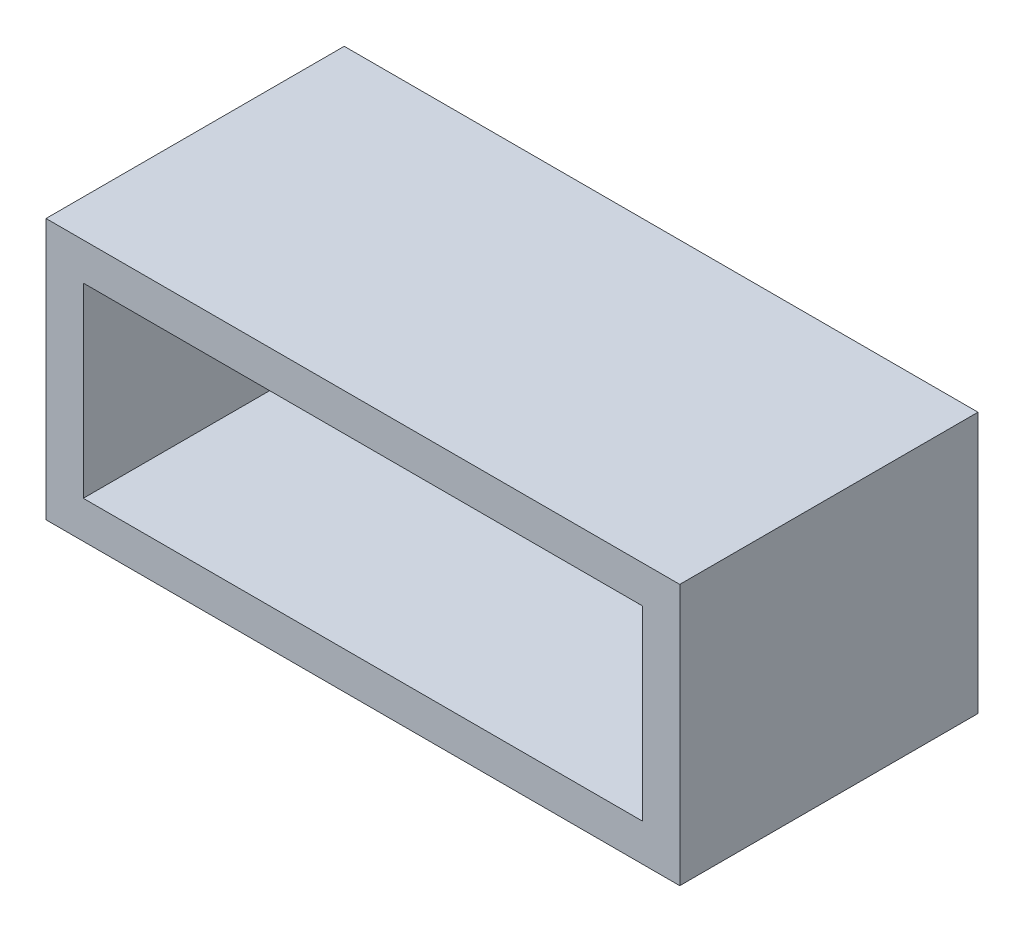
ISO-10303-21;
HEADER;
FILE_DESCRIPTION(('STEP AP214'),'2;1');
FILE_NAME('part.step','',(''),(''),'','','');
FILE_SCHEMA(('AUTOMOTIVE_DESIGN { 1 0 10303 214 1 1 1 1 }'));
ENDSEC;
DATA;
#1=APPLICATION_CONTEXT('core data for automotive mechanical design processes');
#2=APPLICATION_PROTOCOL_DEFINITION('international standard','automotive_design',2000,#1);
#3=PRODUCT_CONTEXT('',#1,'mechanical');
#4=PRODUCT('Part','Part','',(#3));
#5=PRODUCT_RELATED_PRODUCT_CATEGORY('part','',(#4));
#6=PRODUCT_DEFINITION_FORMATION('','',#4);
#7=PRODUCT_DEFINITION_CONTEXT('part definition',#1,'design');
#8=PRODUCT_DEFINITION('design','',#6,#7);
#9=PRODUCT_DEFINITION_SHAPE('','',#8);
#10=(LENGTH_UNIT() NAMED_UNIT(*) SI_UNIT(.MILLI.,.METRE.));
#11=(NAMED_UNIT(*) PLANE_ANGLE_UNIT() SI_UNIT($,.RADIAN.));
#12=(NAMED_UNIT(*) SI_UNIT($,.STERADIAN.) SOLID_ANGLE_UNIT());
#13=UNCERTAINTY_MEASURE_WITH_UNIT(LENGTH_MEASURE(1.E-05),#10,'distance_accuracy_value','');
#14=(GEOMETRIC_REPRESENTATION_CONTEXT(3) GLOBAL_UNCERTAINTY_ASSIGNED_CONTEXT((#13)) GLOBAL_UNIT_ASSIGNED_CONTEXT((#10,
#11,#12)) REPRESENTATION_CONTEXT('',''));
#15=CARTESIAN_POINT('',(0.,0.,0.));
#16=DIRECTION('',(0.,0.,1.));
#17=DIRECTION('',(1.,0.,0.));
#18=AXIS2_PLACEMENT_3D('',#15,#16,#17);
#19=CARTESIAN_POINT('',(75.,-25.,80.));
#20=DIRECTION('',(-1.,0.,0.));
#21=DIRECTION('',(0.,-1.,0.));
#22=AXIS2_PLACEMENT_3D('',#19,#20,#21);
#23=PLANE('',#22);
#24=DIRECTION('',(0.,1.,0.));
#25=VECTOR('',#24,1.);
#26=CARTESIAN_POINT('',(75.,25.,10.));
#27=LINE('',#26,#25);
#28=CARTESIAN_POINT('',(75.,12.,9.99999999999999));
#29=VERTEX_POINT('',#28);
#30=CARTESIAN_POINT('',(75.,25.,9.99999999999999));
#31=VERTEX_POINT('',#30);
#32=EDGE_CURVE('E181',#29,#31,#27,.T.);
#33=ORIENTED_EDGE('',*,*,#32,.F.);
#34=DIRECTION('',(0.,0.,1.));
#35=VECTOR('',#34,1.);
#36=CARTESIAN_POINT('',(75.,12.,0.));
#37=LINE('',#36,#35);
#38=CARTESIAN_POINT('',(75.,12.,0.));
#39=VERTEX_POINT('',#38);
#40=EDGE_CURVE('E190',#39,#29,#37,.T.);
#41=ORIENTED_EDGE('',*,*,#40,.F.);
#42=DIRECTION('',(0.,1.,0.));
#43=VECTOR('',#42,1.);
#44=CARTESIAN_POINT('',(75.,-25.,0.));
#45=LINE('',#44,#43);
#46=CARTESIAN_POINT('',(75.,-25.,0.));
#47=VERTEX_POINT('',#46);
#48=EDGE_CURVE('E218',#47,#39,#45,.T.);
#49=ORIENTED_EDGE('',*,*,#48,.F.);
#50=DIRECTION('',(0.,0.,-1.));
#51=VECTOR('',#50,1.);
#52=CARTESIAN_POINT('',(75.,-25.,80.));
#53=LINE('',#52,#51);
#54=CARTESIAN_POINT('',(75.,-25.,80.));
#55=VERTEX_POINT('',#54);
#56=EDGE_CURVE('E226',#55,#47,#53,.T.);
#57=ORIENTED_EDGE('',*,*,#56,.F.);
#58=DIRECTION('',(0.,1.,0.));
#59=VECTOR('',#58,1.);
#60=CARTESIAN_POINT('',(75.,-25.,80.));
#61=LINE('',#60,#59);
#62=CARTESIAN_POINT('',(75.,25.,80.));
#63=VERTEX_POINT('',#62);
#64=EDGE_CURVE('E208',#55,#63,#61,.T.);
#65=ORIENTED_EDGE('',*,*,#64,.T.);
#66=DIRECTION('',(0.,0.,-1.));
#67=VECTOR('',#66,1.);
#68=CARTESIAN_POINT('',(75.,25.,80.));
#69=LINE('',#68,#67);
#70=EDGE_CURVE('E223',#63,#31,#69,.T.);
#71=ORIENTED_EDGE('',*,*,#70,.T.);
#72=EDGE_LOOP('',(#33,#41,#49,#57,#65,#71));
#73=FACE_BOUND('',#72,.T.);
#74=ADVANCED_FACE('F42',(#73),#23,.T.);
#75=CARTESIAN_POINT('',(-75.0000000000001,25.,80.));
#76=DIRECTION('',(0.,-1.,0.));
#77=DIRECTION('',(1.,0.,0.));
#78=AXIS2_PLACEMENT_3D('',#75,#76,#77);
#79=PLANE('',#78);
#80=DIRECTION('',(-1.,0.,0.));
#81=VECTOR('',#80,1.);
#82=CARTESIAN_POINT('',(-60.,25.,10.));
#83=LINE('',#82,#81);
#84=CARTESIAN_POINT('',(-60.,25.,9.99999999999999));
#85=VERTEX_POINT('',#84);
#86=CARTESIAN_POINT('',(-75.0000000000001,25.,9.99999999999999));
#87=VERTEX_POINT('',#86);
#88=EDGE_CURVE('E59',#85,#87,#83,.T.);
#89=ORIENTED_EDGE('',*,*,#88,.F.);
#90=DIRECTION('',(0.,0.,-1.));
#91=VECTOR('',#90,1.);
#92=CARTESIAN_POINT('',(-60.,25.,0.));
#93=LINE('',#92,#91);
#94=CARTESIAN_POINT('',(-60.,25.,0.));
#95=VERTEX_POINT('',#94);
#96=EDGE_CURVE('E63',#85,#95,#93,.T.);
#97=ORIENTED_EDGE('',*,*,#96,.T.);
#98=DIRECTION('',(-1.,0.,0.));
#99=VECTOR('',#98,1.);
#100=CARTESIAN_POINT('',(-75.0000000000001,25.,0.));
#101=LINE('',#100,#99);
#102=CARTESIAN_POINT('',(60.,25.,0.));
#103=VERTEX_POINT('',#102);
#104=EDGE_CURVE('E206',#103,#95,#101,.T.);
#105=ORIENTED_EDGE('',*,*,#104,.F.);
#106=DIRECTION('',(0.,0.,-1.));
#107=VECTOR('',#106,1.);
#108=CARTESIAN_POINT('',(60.,25.,0.));
#109=LINE('',#108,#107);
#110=CARTESIAN_POINT('',(60.,25.,9.99999999999999));
#111=VERTEX_POINT('',#110);
#112=EDGE_CURVE('E186',#111,#103,#109,.T.);
#113=ORIENTED_EDGE('',*,*,#112,.F.);
#114=DIRECTION('',(1.,0.,0.));
#115=VECTOR('',#114,1.);
#116=CARTESIAN_POINT('',(60.,25.,10.));
#117=LINE('',#116,#115);
#118=EDGE_CURVE('E189',#111,#31,#117,.T.);
#119=ORIENTED_EDGE('',*,*,#118,.T.);
#120=ORIENTED_EDGE('',*,*,#70,.F.);
#121=DIRECTION('',(-1.,0.,0.));
#122=VECTOR('',#121,1.);
#123=CARTESIAN_POINT('',(-75.0000000000001,25.,80.));
#124=LINE('',#123,#122);
#125=CARTESIAN_POINT('',(-75.0000000000001,25.,80.));
#126=VERTEX_POINT('',#125);
#127=EDGE_CURVE('E211',#63,#126,#124,.T.);
#128=ORIENTED_EDGE('',*,*,#127,.T.);
#129=DIRECTION('',(0.,0.,-1.));
#130=VECTOR('',#129,1.);
#131=CARTESIAN_POINT('',(-75.0000000000001,25.,80.));
#132=LINE('',#131,#130);
#133=EDGE_CURVE('E213',#126,#87,#132,.T.);
#134=ORIENTED_EDGE('',*,*,#133,.T.);
#135=EDGE_LOOP('',(#89,#97,#105,#113,#119,#120,#128,#134));
#136=FACE_BOUND('',#135,.T.);
#137=ADVANCED_FACE('F276',(#136),#79,.T.);
#138=CARTESIAN_POINT('',(0.,0.,80.));
#139=DIRECTION('',(0.,0.,-1.));
#140=DIRECTION('',(-1.,0.,0.));
#141=AXIS2_PLACEMENT_3D('',#138,#139,#140);
#142=PLANE('',#141);
#143=DIRECTION('',(0.,1.,0.));
#144=VECTOR('',#143,1.);
#145=CARTESIAN_POINT('',(85.,-35.,80.));
#146=LINE('',#145,#144);
#147=CARTESIAN_POINT('',(85.,-35.,80.));
#148=VERTEX_POINT('',#147);
#149=CARTESIAN_POINT('',(85.,35.,80.));
#150=VERTEX_POINT('',#149);
#151=EDGE_CURVE('E232',#148,#150,#146,.T.);
#152=ORIENTED_EDGE('',*,*,#151,.T.);
#153=DIRECTION('',(-1.,0.,0.));
#154=VECTOR('',#153,1.);
#155=CARTESIAN_POINT('',(-85.,35.,80.));
#156=LINE('',#155,#154);
#157=CARTESIAN_POINT('',(-85.,35.,80.));
#158=VERTEX_POINT('',#157);
#159=EDGE_CURVE('E235',#150,#158,#156,.T.);
#160=ORIENTED_EDGE('',*,*,#159,.T.);
#161=DIRECTION('',(0.,-1.,0.));
#162=VECTOR('',#161,1.);
#163=CARTESIAN_POINT('',(-85.,-35.,80.));
#164=LINE('',#163,#162);
#165=CARTESIAN_POINT('',(-85.,-35.,80.));
#166=VERTEX_POINT('',#165);
#167=EDGE_CURVE('E238',#158,#166,#164,.T.);
#168=ORIENTED_EDGE('',*,*,#167,.T.);
#169=DIRECTION('',(1.,0.,0.));
#170=VECTOR('',#169,1.);
#171=CARTESIAN_POINT('',(-85.,-35.,80.));
#172=LINE('',#171,#170);
#173=EDGE_CURVE('E240',#166,#148,#172,.T.);
#174=ORIENTED_EDGE('',*,*,#173,.T.);
#175=EDGE_LOOP('',(#152,#160,#168,#174));
#176=FACE_BOUND('',#175,.T.);
#177=DIRECTION('',(0.,-1.,0.));
#178=VECTOR('',#177,1.);
#179=CARTESIAN_POINT('',(-75.0000000000001,-25.,80.));
#180=LINE('',#179,#178);
#181=CARTESIAN_POINT('',(-75.0000000000001,-25.,80.));
#182=VERTEX_POINT('',#181);
#183=EDGE_CURVE('E203',#126,#182,#180,.T.);
#184=ORIENTED_EDGE('',*,*,#183,.F.);
#185=ORIENTED_EDGE('',*,*,#127,.F.);
#186=ORIENTED_EDGE('',*,*,#64,.F.);
#187=DIRECTION('',(1.,0.,0.));
#188=VECTOR('',#187,1.);
#189=CARTESIAN_POINT('',(-75.0000000000001,-25.,80.));
#190=LINE('',#189,#188);
#191=EDGE_CURVE('E205',#182,#55,#190,.T.);
#192=ORIENTED_EDGE('',*,*,#191,.F.);
#193=EDGE_LOOP('',(#184,#185,#186,#192));
#194=FACE_BOUND('',#193,.T.);
#195=ADVANCED_FACE('F282',(#176,#194),#142,.F.);
#196=CARTESIAN_POINT('',(0.,0.,0.));
#197=DIRECTION('',(0.,0.,-1.));
#198=DIRECTION('',(-1.,0.,0.));
#199=AXIS2_PLACEMENT_3D('',#196,#197,#198);
#200=PLANE('',#199);
#201=CARTESIAN_POINT('',(-69.4311004696068,20.0599089747284,0.));
#202=DIRECTION('',(0.,0.,1.));
#203=DIRECTION('',(1.,0.,0.));
#204=AXIS2_PLACEMENT_3D('',#201,#202,#203);
#205=CIRCLE('',#204,2.38154170476223);
#206=CARTESIAN_POINT('',(-67.0495587648446,20.0599089747284,0.));
#207=VERTEX_POINT('',#206);
#208=EDGE_CURVE('E346',#207,#207,#205,.T.);
#209=ORIENTED_EDGE('',*,*,#208,.T.);
#210=EDGE_LOOP('',(#209));
#211=FACE_BOUND('',#210,.T.);
#212=CARTESIAN_POINT('',(69.4311004696068,20.0599089747284,0.));
#213=DIRECTION('',(0.,0.,-1.));
#214=DIRECTION('',(-1.,0.,0.));
#215=AXIS2_PLACEMENT_3D('',#212,#213,#214);
#216=CIRCLE('',#215,2.38154170476223);
#217=CARTESIAN_POINT('',(67.0495587648446,20.0599089747284,0.));
#218=VERTEX_POINT('',#217);
#219=EDGE_CURVE('E173',#218,#218,#216,.T.);
#220=ORIENTED_EDGE('',*,*,#219,.F.);
#221=EDGE_LOOP('',(#220));
#222=FACE_BOUND('',#221,.T.);
#223=ORIENTED_EDGE('',*,*,#48,.T.);
#224=DIRECTION('',(1.,0.,0.));
#225=VECTOR('',#224,1.);
#226=CARTESIAN_POINT('',(60.,12.,0.));
#227=LINE('',#226,#225);
#228=CARTESIAN_POINT('',(60.,12.,0.));
#229=VERTEX_POINT('',#228);
#230=EDGE_CURVE('E199',#229,#39,#227,.T.);
#231=ORIENTED_EDGE('',*,*,#230,.F.);
#232=DIRECTION('',(0.,-1.,0.));
#233=VECTOR('',#232,1.);
#234=CARTESIAN_POINT('',(60.,25.,0.));
#235=LINE('',#234,#233);
#236=EDGE_CURVE('E177',#103,#229,#235,.T.);
#237=ORIENTED_EDGE('',*,*,#236,.F.);
#238=ORIENTED_EDGE('',*,*,#104,.T.);
#239=DIRECTION('',(0.,-1.,0.));
#240=VECTOR('',#239,1.);
#241=CARTESIAN_POINT('',(-60.,25.,0.));
#242=LINE('',#241,#240);
#243=CARTESIAN_POINT('',(-60.,12.,0.));
#244=VERTEX_POINT('',#243);
#245=EDGE_CURVE('E170',#95,#244,#242,.T.);
#246=ORIENTED_EDGE('',*,*,#245,.T.);
#247=DIRECTION('',(-1.,0.,0.));
#248=VECTOR('',#247,1.);
#249=CARTESIAN_POINT('',(-60.,12.,0.));
#250=LINE('',#249,#248);
#251=CARTESIAN_POINT('',(-75.,12.,0.));
#252=VERTEX_POINT('',#251);
#253=EDGE_CURVE('E153',#244,#252,#250,.T.);
#254=ORIENTED_EDGE('',*,*,#253,.T.);
#255=DIRECTION('',(0.,-1.,0.));
#256=VECTOR('',#255,1.);
#257=CARTESIAN_POINT('',(-75.0000000000001,-25.,0.));
#258=LINE('',#257,#256);
#259=CARTESIAN_POINT('',(-75.0000000000001,-25.,0.));
#260=VERTEX_POINT('',#259);
#261=EDGE_CURVE('E202',#252,#260,#258,.T.);
#262=ORIENTED_EDGE('',*,*,#261,.T.);
#263=DIRECTION('',(1.,0.,0.));
#264=VECTOR('',#263,1.);
#265=CARTESIAN_POINT('',(-75.0000000000001,-25.,0.));
#266=LINE('',#265,#264);
#267=EDGE_CURVE('E215',#260,#47,#266,.T.);
#268=ORIENTED_EDGE('',*,*,#267,.T.);
#269=EDGE_LOOP('',(#223,#231,#237,#238,#246,#254,#262,#268));
#270=FACE_BOUND('',#269,.T.);
#271=DIRECTION('',(0.,1.,0.));
#272=VECTOR('',#271,1.);
#273=CARTESIAN_POINT('',(85.,-35.,0.));
#274=LINE('',#273,#272);
#275=CARTESIAN_POINT('',(85.,-35.,0.));
#276=VERTEX_POINT('',#275);
#277=CARTESIAN_POINT('',(85.,35.,0.));
#278=VERTEX_POINT('',#277);
#279=EDGE_CURVE('E231',#276,#278,#274,.T.);
#280=ORIENTED_EDGE('',*,*,#279,.F.);
#281=DIRECTION('',(1.,0.,0.));
#282=VECTOR('',#281,1.);
#283=CARTESIAN_POINT('',(-85.,-35.,0.));
#284=LINE('',#283,#282);
#285=CARTESIAN_POINT('',(-85.,-35.,0.));
#286=VERTEX_POINT('',#285);
#287=EDGE_CURVE('E236',#286,#276,#284,.T.);
#288=ORIENTED_EDGE('',*,*,#287,.F.);
#289=DIRECTION('',(0.,-1.,0.));
#290=VECTOR('',#289,1.);
#291=CARTESIAN_POINT('',(-85.,-35.,0.));
#292=LINE('',#291,#290);
#293=CARTESIAN_POINT('',(-85.,35.,0.));
#294=VERTEX_POINT('',#293);
#295=EDGE_CURVE('E247',#294,#286,#292,.T.);
#296=ORIENTED_EDGE('',*,*,#295,.F.);
#297=DIRECTION('',(-1.,0.,0.));
#298=VECTOR('',#297,1.);
#299=CARTESIAN_POINT('',(-85.,35.,0.));
#300=LINE('',#299,#298);
#301=EDGE_CURVE('E245',#278,#294,#300,.T.);
#302=ORIENTED_EDGE('',*,*,#301,.F.);
#303=EDGE_LOOP('',(#280,#288,#296,#302));
#304=FACE_BOUND('',#303,.T.);
#305=ADVANCED_FACE('F298',(#211,#222,#270,#304),#200,.T.);
#306=CARTESIAN_POINT('',(85.,-35.,80.));
#307=DIRECTION('',(-1.,0.,0.));
#308=DIRECTION('',(0.,0.,1.));
#309=AXIS2_PLACEMENT_3D('',#306,#307,#308);
#310=PLANE('',#309);
#311=ORIENTED_EDGE('',*,*,#279,.T.);
#312=DIRECTION('',(0.,0.,-1.));
#313=VECTOR('',#312,1.);
#314=CARTESIAN_POINT('',(85.,35.,80.));
#315=LINE('',#314,#313);
#316=EDGE_CURVE('E11',#150,#278,#315,.T.);
#317=ORIENTED_EDGE('',*,*,#316,.F.);
#318=ORIENTED_EDGE('',*,*,#151,.F.);
#319=DIRECTION('',(0.,0.,-1.));
#320=VECTOR('',#319,1.);
#321=CARTESIAN_POINT('',(85.,-35.,80.));
#322=LINE('',#321,#320);
#323=EDGE_CURVE('E242',#148,#276,#322,.T.);
#324=ORIENTED_EDGE('',*,*,#323,.T.);
#325=EDGE_LOOP('',(#311,#317,#318,#324));
#326=FACE_BOUND('',#325,.T.);
#327=ADVANCED_FACE('F44',(#326),#310,.F.);
#328=CARTESIAN_POINT('',(-85.,35.,80.));
#329=DIRECTION('',(0.,-1.,0.));
#330=DIRECTION('',(0.,0.,-1.));
#331=AXIS2_PLACEMENT_3D('',#328,#329,#330);
#332=PLANE('',#331);
#333=ORIENTED_EDGE('',*,*,#301,.T.);
#334=DIRECTION('',(0.,0.,-1.));
#335=VECTOR('',#334,1.);
#336=CARTESIAN_POINT('',(-85.,35.,80.));
#337=LINE('',#336,#335);
#338=EDGE_CURVE('E51',#158,#294,#337,.T.);
#339=ORIENTED_EDGE('',*,*,#338,.F.);
#340=ORIENTED_EDGE('',*,*,#159,.F.);
#341=ORIENTED_EDGE('',*,*,#316,.T.);
#342=EDGE_LOOP('',(#333,#339,#340,#341));
#343=FACE_BOUND('',#342,.T.);
#344=ADVANCED_FACE('F308',(#343),#332,.F.);
#345=CARTESIAN_POINT('',(-85.,-35.,80.));
#346=DIRECTION('',(1.,0.,0.));
#347=DIRECTION('',(0.,0.,-1.));
#348=AXIS2_PLACEMENT_3D('',#345,#346,#347);
#349=PLANE('',#348);
#350=ORIENTED_EDGE('',*,*,#295,.T.);
#351=DIRECTION('',(0.,0.,-1.));
#352=VECTOR('',#351,1.);
#353=CARTESIAN_POINT('',(-85.,-35.,80.));
#354=LINE('',#353,#352);
#355=EDGE_CURVE('E252',#166,#286,#354,.T.);
#356=ORIENTED_EDGE('',*,*,#355,.F.);
#357=ORIENTED_EDGE('',*,*,#167,.F.);
#358=ORIENTED_EDGE('',*,*,#338,.T.);
#359=EDGE_LOOP('',(#350,#356,#357,#358));
#360=FACE_BOUND('',#359,.T.);
#361=ADVANCED_FACE('F305',(#360),#349,.F.);
#362=CARTESIAN_POINT('',(-85.,-35.,80.));
#363=DIRECTION('',(0.,1.,0.));
#364=DIRECTION('',(0.,0.,1.));
#365=AXIS2_PLACEMENT_3D('',#362,#363,#364);
#366=PLANE('',#365);
#367=ORIENTED_EDGE('',*,*,#287,.T.);
#368=ORIENTED_EDGE('',*,*,#323,.F.);
#369=ORIENTED_EDGE('',*,*,#173,.F.);
#370=ORIENTED_EDGE('',*,*,#355,.T.);
#371=EDGE_LOOP('',(#367,#368,#369,#370));
#372=FACE_BOUND('',#371,.T.);
#373=ADVANCED_FACE('F294',(#372),#366,.F.);
#374=CARTESIAN_POINT('',(-75.0000000000001,-25.,80.));
#375=DIRECTION('',(1.,0.,0.));
#376=DIRECTION('',(0.,0.,-1.));
#377=AXIS2_PLACEMENT_3D('',#374,#375,#376);
#378=PLANE('',#377);
#379=DIRECTION('',(0.,1.,0.));
#380=VECTOR('',#379,1.);
#381=CARTESIAN_POINT('',(-75.,25.,10.));
#382=LINE('',#381,#380);
#383=CARTESIAN_POINT('',(-75.0000000000001,12.,9.99999999999999));
#384=VERTEX_POINT('',#383);
#385=EDGE_CURVE('E149',#384,#87,#382,.T.);
#386=ORIENTED_EDGE('',*,*,#385,.T.);
#387=ORIENTED_EDGE('',*,*,#133,.F.);
#388=ORIENTED_EDGE('',*,*,#183,.T.);
#389=DIRECTION('',(0.,0.,-1.));
#390=VECTOR('',#389,1.);
#391=CARTESIAN_POINT('',(-75.0000000000001,-25.,80.));
#392=LINE('',#391,#390);
#393=EDGE_CURVE('E228',#182,#260,#392,.T.);
#394=ORIENTED_EDGE('',*,*,#393,.T.);
#395=ORIENTED_EDGE('',*,*,#261,.F.);
#396=DIRECTION('',(0.,0.,1.));
#397=VECTOR('',#396,1.);
#398=CARTESIAN_POINT('',(-75.,12.,0.));
#399=LINE('',#398,#397);
#400=EDGE_CURVE('E169',#252,#384,#399,.T.);
#401=ORIENTED_EDGE('',*,*,#400,.T.);
#402=EDGE_LOOP('',(#386,#387,#388,#394,#395,#401));
#403=FACE_BOUND('',#402,.T.);
#404=ADVANCED_FACE('F290',(#403),#378,.T.);
#405=CARTESIAN_POINT('',(-75.0000000000001,-25.,80.));
#406=DIRECTION('',(0.,1.,0.));
#407=DIRECTION('',(0.,0.,1.));
#408=AXIS2_PLACEMENT_3D('',#405,#406,#407);
#409=PLANE('',#408);
#410=ORIENTED_EDGE('',*,*,#267,.F.);
#411=ORIENTED_EDGE('',*,*,#393,.F.);
#412=ORIENTED_EDGE('',*,*,#191,.T.);
#413=ORIENTED_EDGE('',*,*,#56,.T.);
#414=EDGE_LOOP('',(#410,#411,#412,#413));
#415=FACE_BOUND('',#414,.T.);
#416=ADVANCED_FACE('F286',(#415),#409,.T.);
#417=CARTESIAN_POINT('',(60.,12.,0.));
#418=DIRECTION('',(0.,1.,0.));
#419=DIRECTION('',(-1.,0.,0.));
#420=AXIS2_PLACEMENT_3D('',#417,#418,#419);
#421=PLANE('',#420);
#422=ORIENTED_EDGE('',*,*,#40,.T.);
#423=DIRECTION('',(1.,0.,0.));
#424=VECTOR('',#423,1.);
#425=CARTESIAN_POINT('',(60.,12.,10.));
#426=LINE('',#425,#424);
#427=CARTESIAN_POINT('',(60.,12.,10.));
#428=VERTEX_POINT('',#427);
#429=EDGE_CURVE('E196',#428,#29,#426,.T.);
#430=ORIENTED_EDGE('',*,*,#429,.F.);
#431=DIRECTION('',(0.,0.,1.));
#432=VECTOR('',#431,1.);
#433=CARTESIAN_POINT('',(60.,12.,0.));
#434=LINE('',#433,#432);
#435=EDGE_CURVE('E180',#229,#428,#434,.T.);
#436=ORIENTED_EDGE('',*,*,#435,.F.);
#437=ORIENTED_EDGE('',*,*,#230,.T.);
#438=EDGE_LOOP('',(#422,#430,#436,#437));
#439=FACE_BOUND('',#438,.T.);
#440=ADVANCED_FACE('F289',(#439),#421,.F.);
#441=CARTESIAN_POINT('',(60.,25.,10.));
#442=DIRECTION('',(0.,0.,-1.));
#443=DIRECTION('',(0.,1.,0.));
#444=AXIS2_PLACEMENT_3D('',#441,#442,#443);
#445=PLANE('',#444);
#446=CARTESIAN_POINT('',(69.4311004696068,20.0599089747284,10.));
#447=DIRECTION('',(0.,0.,-1.));
#448=DIRECTION('',(0.,1.,0.));
#449=AXIS2_PLACEMENT_3D('',#446,#447,#448);
#450=CIRCLE('',#449,2.38154170476223);
#451=CARTESIAN_POINT('',(69.4311004696068,22.4414506794906,10.));
#452=VERTEX_POINT('',#451);
#453=EDGE_CURVE('E176',#452,#452,#450,.T.);
#454=ORIENTED_EDGE('',*,*,#453,.T.);
#455=EDGE_LOOP('',(#454));
#456=FACE_BOUND('',#455,.T.);
#457=ORIENTED_EDGE('',*,*,#32,.T.);
#458=ORIENTED_EDGE('',*,*,#118,.F.);
#459=DIRECTION('',(0.,1.,0.));
#460=VECTOR('',#459,1.);
#461=CARTESIAN_POINT('',(60.,25.,10.));
#462=LINE('',#461,#460);
#463=EDGE_CURVE('E183',#428,#111,#462,.T.);
#464=ORIENTED_EDGE('',*,*,#463,.F.);
#465=ORIENTED_EDGE('',*,*,#429,.T.);
#466=EDGE_LOOP('',(#457,#458,#464,#465));
#467=FACE_BOUND('',#466,.T.);
#468=ADVANCED_FACE('F259',(#456,#467),#445,.F.);
#469=CARTESIAN_POINT('',(60.,0.,0.));
#470=DIRECTION('',(-1.,0.,0.));
#471=DIRECTION('',(0.,0.,1.));
#472=AXIS2_PLACEMENT_3D('',#469,#470,#471);
#473=PLANE('',#472);
#474=ORIENTED_EDGE('',*,*,#236,.T.);
#475=ORIENTED_EDGE('',*,*,#435,.T.);
#476=ORIENTED_EDGE('',*,*,#463,.T.);
#477=ORIENTED_EDGE('',*,*,#112,.T.);
#478=EDGE_LOOP('',(#474,#475,#476,#477));
#479=FACE_BOUND('',#478,.T.);
#480=ADVANCED_FACE('F264',(#479),#473,.T.);
#481=CARTESIAN_POINT('',(69.4311004696068,20.0599089747284,15.));
#482=DIRECTION('',(0.,0.,-1.));
#483=DIRECTION('',(-1.,0.,0.));
#484=AXIS2_PLACEMENT_3D('',#481,#482,#483);
#485=CYLINDRICAL_SURFACE('',#484,2.38154170476223);
#486=ORIENTED_EDGE('',*,*,#219,.T.);
#487=EDGE_LOOP('',(#486));
#488=FACE_BOUND('',#487,.T.);
#489=ORIENTED_EDGE('',*,*,#453,.F.);
#490=EDGE_LOOP('',(#489));
#491=FACE_BOUND('',#490,.T.);
#492=ADVANCED_FACE('F262',(#488,#491),#485,.F.);
#493=CARTESIAN_POINT('',(-60.,25.,10.));
#494=DIRECTION('',(0.,0.,1.));
#495=DIRECTION('',(0.,-1.,0.));
#496=AXIS2_PLACEMENT_3D('',#493,#494,#495);
#497=PLANE('',#496);
#498=CARTESIAN_POINT('',(-69.4311004696068,20.0599089747284,10.));
#499=DIRECTION('',(0.,0.,1.));
#500=DIRECTION('',(0.,-1.,0.));
#501=AXIS2_PLACEMENT_3D('',#498,#499,#500);
#502=CIRCLE('',#501,2.38154170476223);
#503=CARTESIAN_POINT('',(-69.4311004696068,17.6783672699661,10.));
#504=VERTEX_POINT('',#503);
#505=EDGE_CURVE('E46',#504,#504,#502,.F.);
#506=ORIENTED_EDGE('',*,*,#505,.T.);
#507=EDGE_LOOP('',(#506));
#508=FACE_BOUND('',#507,.T.);
#509=ORIENTED_EDGE('',*,*,#385,.F.);
#510=DIRECTION('',(-1.,0.,0.));
#511=VECTOR('',#510,1.);
#512=CARTESIAN_POINT('',(-60.,12.,10.));
#513=LINE('',#512,#511);
#514=CARTESIAN_POINT('',(-60.,12.,10.));
#515=VERTEX_POINT('',#514);
#516=EDGE_CURVE('E145',#515,#384,#513,.T.);
#517=ORIENTED_EDGE('',*,*,#516,.F.);
#518=DIRECTION('',(0.,1.,0.));
#519=VECTOR('',#518,1.);
#520=CARTESIAN_POINT('',(-60.,25.,10.));
#521=LINE('',#520,#519);
#522=EDGE_CURVE('E148',#515,#85,#521,.T.);
#523=ORIENTED_EDGE('',*,*,#522,.T.);
#524=ORIENTED_EDGE('',*,*,#88,.T.);
#525=EDGE_LOOP('',(#509,#517,#523,#524));
#526=FACE_BOUND('',#525,.T.);
#527=ADVANCED_FACE('F147',(#508,#526),#497,.T.);
#528=CARTESIAN_POINT('',(-60.,12.,0.));
#529=DIRECTION('',(0.,-1.,0.));
#530=DIRECTION('',(1.,0.,0.));
#531=AXIS2_PLACEMENT_3D('',#528,#529,#530);
#532=PLANE('',#531);
#533=ORIENTED_EDGE('',*,*,#400,.F.);
#534=ORIENTED_EDGE('',*,*,#253,.F.);
#535=DIRECTION('',(0.,0.,1.));
#536=VECTOR('',#535,1.);
#537=CARTESIAN_POINT('',(-60.,12.,0.));
#538=LINE('',#537,#536);
#539=EDGE_CURVE('E159',#244,#515,#538,.T.);
#540=ORIENTED_EDGE('',*,*,#539,.T.);
#541=ORIENTED_EDGE('',*,*,#516,.T.);
#542=EDGE_LOOP('',(#533,#534,#540,#541));
#543=FACE_BOUND('',#542,.T.);
#544=ADVANCED_FACE('F161',(#543),#532,.T.);
#545=CARTESIAN_POINT('',(-60.,0.,0.));
#546=DIRECTION('',(1.,0.,0.));
#547=DIRECTION('',(0.,0.,1.));
#548=AXIS2_PLACEMENT_3D('',#545,#546,#547);
#549=PLANE('',#548);
#550=ORIENTED_EDGE('',*,*,#245,.F.);
#551=ORIENTED_EDGE('',*,*,#96,.F.);
#552=ORIENTED_EDGE('',*,*,#522,.F.);
#553=ORIENTED_EDGE('',*,*,#539,.F.);
#554=EDGE_LOOP('',(#550,#551,#552,#553));
#555=FACE_BOUND('',#554,.T.);
#556=ADVANCED_FACE('F158',(#555),#549,.T.);
#557=CARTESIAN_POINT('',(-69.4311004696068,20.0599089747284,15.));
#558=DIRECTION('',(0.,0.,-1.));
#559=DIRECTION('',(-1.,0.,0.));
#560=AXIS2_PLACEMENT_3D('',#557,#558,#559);
#561=CYLINDRICAL_SURFACE('',#560,2.38154170476223);
#562=ORIENTED_EDGE('',*,*,#505,.F.);
#563=EDGE_LOOP('',(#562));
#564=FACE_BOUND('',#563,.T.);
#565=ORIENTED_EDGE('',*,*,#208,.F.);
#566=EDGE_LOOP('',(#565));
#567=FACE_BOUND('',#566,.T.);
#568=ADVANCED_FACE('F352',(#564,#567),#561,.F.);
#569=CLOSED_SHELL('',(#74,#137,#195,#305,#327,#344,#361,#373,#404,#416,#440,#468,#480,#492,#527,
#544,#556,#568));
#570=MANIFOLD_SOLID_BREP('B2',#569);
#571=ADVANCED_BREP_SHAPE_REPRESENTATION('',(#18,#570),#14);
#572=SHAPE_DEFINITION_REPRESENTATION(#9,#571);
ENDSEC;
END-ISO-10303-21;
